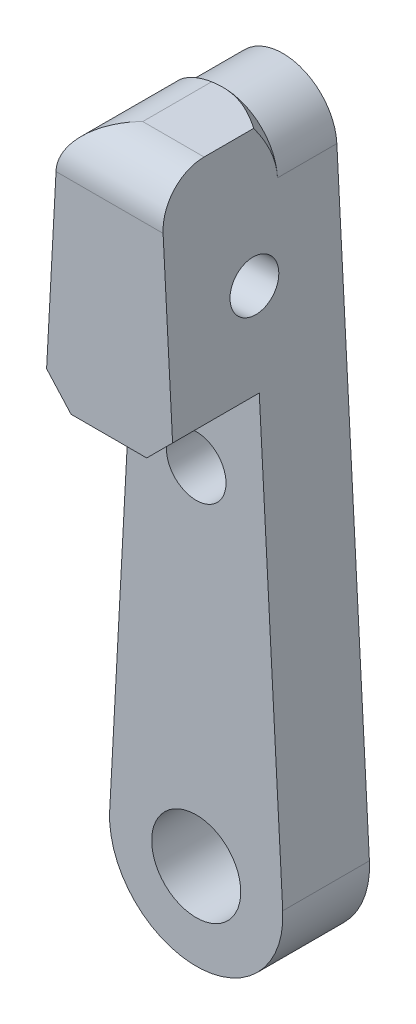
ISO-10303-21;
HEADER;
FILE_DESCRIPTION(('STEP AP214'),'2;1');
FILE_NAME('part.step','',(''),(''),'','','');
FILE_SCHEMA(('AUTOMOTIVE_DESIGN { 1 0 10303 214 1 1 1 1 }'));
ENDSEC;
DATA;
#1=APPLICATION_CONTEXT('core data for automotive mechanical design processes');
#2=APPLICATION_PROTOCOL_DEFINITION('international standard','automotive_design',2000,#1);
#3=PRODUCT_CONTEXT('',#1,'mechanical');
#4=PRODUCT('Part','Part','',(#3));
#5=PRODUCT_RELATED_PRODUCT_CATEGORY('part','',(#4));
#6=PRODUCT_DEFINITION_FORMATION('','',#4);
#7=PRODUCT_DEFINITION_CONTEXT('part definition',#1,'design');
#8=PRODUCT_DEFINITION('design','',#6,#7);
#9=PRODUCT_DEFINITION_SHAPE('','',#8);
#10=(LENGTH_UNIT() NAMED_UNIT(*) SI_UNIT(.MILLI.,.METRE.));
#11=(NAMED_UNIT(*) PLANE_ANGLE_UNIT() SI_UNIT($,.RADIAN.));
#12=(NAMED_UNIT(*) SI_UNIT($,.STERADIAN.) SOLID_ANGLE_UNIT());
#13=UNCERTAINTY_MEASURE_WITH_UNIT(LENGTH_MEASURE(1.E-05),#10,'distance_accuracy_value','');
#14=(GEOMETRIC_REPRESENTATION_CONTEXT(3) GLOBAL_UNCERTAINTY_ASSIGNED_CONTEXT((#13)) GLOBAL_UNIT_ASSIGNED_CONTEXT((#10,
#11,#12)) REPRESENTATION_CONTEXT('',''));
#15=CARTESIAN_POINT('',(0.,0.,0.));
#16=DIRECTION('',(0.,0.,1.));
#17=DIRECTION('',(1.,0.,0.));
#18=AXIS2_PLACEMENT_3D('',#15,#16,#17);
#19=CARTESIAN_POINT('',(-3.95667966414704,44.6628374857144,6.35));
#20=DIRECTION('',(0.998556345686213,-0.0537142857142856,0.));
#21=DIRECTION('',(0.0537142857142856,0.998556345686213,0.));
#22=AXIS2_PLACEMENT_3D('',#19,#20,#21);
#23=PLANE('',#22);
#24=CARTESIAN_POINT('',(-3.92252178054246,45.2978374857144,9.525));
#25=DIRECTION('',(0.998556345686213,-0.0537142857142856,0.));
#26=DIRECTION('',(-0.0537142857142856,-0.998556345686213,0.));
#27=AXIS2_PLACEMENT_3D('',#24,#25,#26);
#28=ELLIPSE('',#27,3.17959022915039,3.175);
#29=CARTESIAN_POINT('',(-3.92252178054246,45.2978374857144,12.7));
#30=VERTEX_POINT('',#29);
#31=CARTESIAN_POINT('',(-3.9133479489458,45.4683803428573,12.6954163975537));
#32=VERTEX_POINT('',#31);
#33=EDGE_CURVE('E390',#30,#32,#28,.F.);
#34=ORIENTED_EDGE('',*,*,#33,.T.);
#35=DIRECTION('',(0.,0.,-1.));
#36=VECTOR('',#35,1.);
#37=CARTESIAN_POINT('',(-3.9133479489458,45.4683803428573,6.35));
#38=LINE('',#37,#36);
#39=CARTESIAN_POINT('',(-3.91334794894579,45.4683803428574,4.43128528600289));
#40=VERTEX_POINT('',#39);
#41=EDGE_CURVE('E388',#32,#40,#38,.T.);
#42=ORIENTED_EDGE('',*,*,#41,.T.);
#43=CARTESIAN_POINT('',(-3.75173236251952,48.4728374857144,5.88839241168434));
#44=CARTESIAN_POINT('',(-3.75785567323401,48.3590042532838,5.80935084688004));
#45=CARTESIAN_POINT('',(-3.7640245767196,48.2443234446395,5.73150004897595));
#46=CARTESIAN_POINT('',(-3.7764732433354,48.0129009305126,5.57877744166713));
#47=CARTESIAN_POINT('',(-3.7827530737117,47.8961579749152,5.50390753553564));
#48=CARTESIAN_POINT('',(-3.79552221315823,47.6587778244817,5.35684776592851));
#49=CARTESIAN_POINT('',(-3.80201321180765,47.5381092201239,5.28470846839702));
#50=CARTESIAN_POINT('',(-3.81513878320356,47.2941029481636,5.14513527033369));
#51=CARTESIAN_POINT('',(-3.82177332842141,47.1707657923229,5.07770047789215));
#52=CARTESIAN_POINT('',(-3.83487793374441,46.9271492826926,4.95182834973537));
#53=CARTESIAN_POINT('',(-3.84134022881052,46.8070142821028,4.89311256937429));
#54=CARTESIAN_POINT('',(-3.854427686651,46.5637165466546,4.78221540453787));
#55=CARTESIAN_POINT('',(-3.8610528818643,46.4405532087515,4.73003533435954));
#56=CARTESIAN_POINT('',(-3.87443527855589,46.1917725173734,4.6339964827562));
#57=CARTESIAN_POINT('',(-3.88119156769469,46.0661721244216,4.59009404756772));
#58=CARTESIAN_POINT('',(-3.8948618550632,45.8120395036921,4.51197518938171));
#59=CARTESIAN_POINT('',(-3.90177573728429,45.6835094325317,4.47775187525206));
#60=CARTESIAN_POINT('',(-3.91266200301432,45.4811321770027,4.4332292663888));
#61=CARTESIAN_POINT('',(-3.91658899549159,45.4081288184829,4.41903125189004));
#62=CARTESIAN_POINT('',(-3.92447920516732,45.2614486786333,4.39443691015024));
#63=CARTESIAN_POINT('',(-3.92844243640039,45.1877716363981,4.38404212581209));
#64=CARTESIAN_POINT('',(-3.93644463133202,45.0390096744334,4.36717170249807));
#65=CARTESIAN_POINT('',(-3.94048391373614,44.9639188299212,4.36074814703654));
#66=CARTESIAN_POINT('',(-3.94857523962854,44.8134999104952,4.35215416375258));
#67=CARTESIAN_POINT('',(-3.95262728242178,44.7381718485025,4.34998350815793));
#68=CARTESIAN_POINT('',(-3.95667966414704,44.6628374857144,4.34999999999998));
#69=B_SPLINE_CURVE_WITH_KNOTS('',3,(#43,#44,#45,#46,#47,#48,#49,#50,#51,#52,#53,#54,#55,#56,#57,
#58,#59,#60,#61,#62,#63,#64,#65,#66,#67,#68),.UNSPECIFIED.,.F.,.F.,(4,2,2,2,2,2,2,2,2,2,2,2,4),
(0.,0.416178927517582,0.83261945418778,1.25474733928982,1.67679497601198,2.07825355600473,
2.47979273803573,2.87915116412819,3.27822454372349,3.50156316257956,3.72499228574556,
3.95129279783771,4.17758118964001),.UNSPECIFIED.);
#70=CARTESIAN_POINT('',(-3.95667966414704,44.6628374857144,4.34999999999999));
#71=VERTEX_POINT('',#70);
#72=EDGE_CURVE('E266',#40,#71,#69,.T.);
#73=ORIENTED_EDGE('',*,*,#72,.T.);
#74=DIRECTION('',(0.,0.,-1.));
#75=VECTOR('',#74,1.);
#76=CARTESIAN_POINT('',(-3.95667966414704,44.6628374857144,6.35));
#77=LINE('',#76,#75);
#78=CARTESIAN_POINT('',(-3.95667966414704,44.6628374857144,0.));
#79=VERTEX_POINT('',#78);
#80=EDGE_CURVE('E209',#71,#79,#77,.T.);
#81=ORIENTED_EDGE('',*,*,#80,.T.);
#82=DIRECTION('',(-0.0537142857142856,-0.998556345686213,0.));
#83=VECTOR('',#82,1.);
#84=CARTESIAN_POINT('',(-3.95667966414704,44.6628374857144,0.));
#85=LINE('',#84,#83);
#86=CARTESIAN_POINT('',(-6.34083279510745,0.34108571428571,0.));
#87=VERTEX_POINT('',#86);
#88=EDGE_CURVE('E236',#79,#87,#85,.T.);
#89=ORIENTED_EDGE('',*,*,#88,.T.);
#90=DIRECTION('',(0.,0.,-1.));
#91=VECTOR('',#90,1.);
#92=CARTESIAN_POINT('',(-6.34083279510745,0.34108571428571,6.35));
#93=LINE('',#92,#91);
#94=CARTESIAN_POINT('',(-6.34083279510745,0.34108571428571,6.35));
#95=VERTEX_POINT('',#94);
#96=EDGE_CURVE('E212',#95,#87,#93,.T.);
#97=ORIENTED_EDGE('',*,*,#96,.F.);
#98=DIRECTION('',(-0.0537142857142856,-0.998556345686213,0.));
#99=VECTOR('',#98,1.);
#100=CARTESIAN_POINT('',(-3.95667966414704,44.6628374857144,6.35));
#101=LINE('',#100,#99);
#102=CARTESIAN_POINT('',(-4.61408291891322,32.4416158313241,6.35));
#103=VERTEX_POINT('',#102);
#104=EDGE_CURVE('E216',#103,#95,#101,.T.);
#105=ORIENTED_EDGE('',*,*,#104,.F.);
#106=DIRECTION('',(0.,0.,1.));
#107=VECTOR('',#106,1.);
#108=CARTESIAN_POINT('',(-4.61408291891322,32.4416158313241,6.35));
#109=LINE('',#108,#107);
#110=CARTESIAN_POINT('',(-4.61408291891322,32.4416158313241,12.7));
#111=VERTEX_POINT('',#110);
#112=EDGE_CURVE('E208',#103,#111,#109,.T.);
#113=ORIENTED_EDGE('',*,*,#112,.T.);
#114=DIRECTION('',(-0.0537142857142856,-0.998556345686213,0.));
#115=VECTOR('',#114,1.);
#116=CARTESIAN_POINT('',(-4.72151149034179,30.4445031399517,12.7));
#117=LINE('',#116,#115);
#118=EDGE_CURVE('E185',#30,#111,#117,.T.);
#119=ORIENTED_EDGE('',*,*,#118,.F.);
#120=EDGE_LOOP('',(#34,#42,#73,#81,#89,#97,#105,#113,#119));
#121=FACE_BOUND('',#120,.T.);
#122=DIRECTION('',(-0.0537142857142856,-0.998556345686213,0.));
#123=VECTOR('',#122,1.);
#124=CARTESIAN_POINT('',(-3.95667966414704,44.6628374857144,3.002));
#125=LINE('',#124,#123);
#126=CARTESIAN_POINT('',(-4.10722604370954,41.8641585005402,3.002));
#127=VERTEX_POINT('',#126);
#128=CARTESIAN_POINT('',(-4.46898440904249,35.139018130439,3.002));
#129=VERTEX_POINT('',#128);
#130=EDGE_CURVE('E402',#127,#129,#125,.T.);
#131=ORIENTED_EDGE('',*,*,#130,.F.);
#132=DIRECTION('',(0.,0.,-1.));
#133=VECTOR('',#132,1.);
#134=CARTESIAN_POINT('',(-4.10722604370954,41.8641585005402,6.35));
#135=LINE('',#134,#133);
#136=CARTESIAN_POINT('',(-4.10722604370954,41.8641585005402,9.698));
#137=VERTEX_POINT('',#136);
#138=EDGE_CURVE('E171',#137,#127,#135,.T.);
#139=ORIENTED_EDGE('',*,*,#138,.F.);
#140=DIRECTION('',(0.0537142857142856,0.998556345686213,0.));
#141=VECTOR('',#140,1.);
#142=CARTESIAN_POINT('',(-3.95667966414704,44.6628374857144,9.698));
#143=LINE('',#142,#141);
#144=CARTESIAN_POINT('',(-4.46898440904249,35.139018130439,9.698));
#145=VERTEX_POINT('',#144);
#146=EDGE_CURVE('E406',#145,#137,#143,.T.);
#147=ORIENTED_EDGE('',*,*,#146,.F.);
#148=DIRECTION('',(0.,0.,1.));
#149=VECTOR('',#148,1.);
#150=CARTESIAN_POINT('',(-4.46898440904249,35.139018130439,6.35));
#151=LINE('',#150,#149);
#152=EDGE_CURVE('E295',#129,#145,#151,.T.);
#153=ORIENTED_EDGE('',*,*,#152,.F.);
#154=EDGE_LOOP('',(#131,#139,#147,#153));
#155=FACE_BOUND('',#154,.T.);
#156=ADVANCED_FACE('F33',(#121,#155),#23,.F.);
#157=CARTESIAN_POINT('',(4.26336093394811,38.9615882930533,6.35));
#158=DIRECTION('',(0.998556345686213,0.0537142857142853,0.));
#159=DIRECTION('',(-0.0537142857142853,0.998556345686213,0.));
#160=AXIS2_PLACEMENT_3D('',#157,#158,#159);
#161=CYLINDRICAL_SURFACE('',#160,1.78600099999999);
#162=CARTESIAN_POINT('',(4.26336093394811,38.9615882930533,6.35));
#163=DIRECTION('',(0.998556345686213,0.0537142857142853,0.));
#164=DIRECTION('',(-0.0537142857142853,0.998556345686213,0.));
#165=AXIS2_PLACEMENT_3D('',#162,#163,#164);
#166=CIRCLE('',#165,1.78600099999999);
#167=CARTESIAN_POINT('',(4.16742716594811,40.7450109250052,6.35));
#168=VERTEX_POINT('',#167);
#169=EDGE_CURVE('E176',#168,#168,#166,.T.);
#170=ORIENTED_EDGE('',*,*,#169,.T.);
#171=EDGE_LOOP('',(#170));
#172=FACE_BOUND('',#171,.T.);
#173=CARTESIAN_POINT('',(-1.95028805188646,38.6273440429463,6.35));
#174=DIRECTION('',(-0.998556345686213,-0.0537142857142853,0.));
#175=DIRECTION('',(0.0537142857142853,-0.998556345686213,0.));
#176=AXIS2_PLACEMENT_3D('',#173,#174,#175);
#177=CIRCLE('',#176,1.78600099999999);
#178=CARTESIAN_POINT('',(-1.85435428388646,36.8439214109944,6.35));
#179=VERTEX_POINT('',#178);
#180=EDGE_CURVE('E172',#179,#179,#177,.F.);
#181=ORIENTED_EDGE('',*,*,#180,.F.);
#182=EDGE_LOOP('',(#181));
#183=FACE_BOUND('',#182,.T.);
#184=ADVANCED_FACE('F306',(#172,#183),#161,.F.);
#185=CARTESIAN_POINT('',(0.,0.,6.35));
#186=DIRECTION('',(0.,0.,-1.));
#187=DIRECTION('',(-1.,0.,0.));
#188=AXIS2_PLACEMENT_3D('',#185,#186,#187);
#189=CYLINDRICAL_SURFACE('',#188,6.35);
#190=CARTESIAN_POINT('',(0.,0.,0.));
#191=DIRECTION('',(0.,0.,1.));
#192=DIRECTION('',(1.,0.,0.));
#193=AXIS2_PLACEMENT_3D('',#190,#191,#192);
#194=CIRCLE('',#193,6.35);
#195=CARTESIAN_POINT('',(6.34083279510745,0.341085714285708,0.));
#196=VERTEX_POINT('',#195);
#197=EDGE_CURVE('E226',#87,#196,#194,.T.);
#198=ORIENTED_EDGE('',*,*,#197,.T.);
#199=DIRECTION('',(0.,0.,-1.));
#200=VECTOR('',#199,1.);
#201=CARTESIAN_POINT('',(6.34083279510745,0.341085714285708,6.35));
#202=LINE('',#201,#200);
#203=CARTESIAN_POINT('',(6.34083279510745,0.341085714285708,6.35));
#204=VERTEX_POINT('',#203);
#205=EDGE_CURVE('E205',#204,#196,#202,.T.);
#206=ORIENTED_EDGE('',*,*,#205,.F.);
#207=CARTESIAN_POINT('',(0.,0.,6.35));
#208=DIRECTION('',(0.,0.,1.));
#209=DIRECTION('',(1.,0.,0.));
#210=AXIS2_PLACEMENT_3D('',#207,#208,#209);
#211=CIRCLE('',#210,6.35);
#212=EDGE_CURVE('E238',#95,#204,#211,.T.);
#213=ORIENTED_EDGE('',*,*,#212,.F.);
#214=ORIENTED_EDGE('',*,*,#96,.T.);
#215=EDGE_LOOP('',(#198,#206,#213,#214));
#216=FACE_BOUND('',#215,.T.);
#217=ADVANCED_FACE('F303',(#216),#189,.T.);
#218=CARTESIAN_POINT('',(3.95667966414706,44.6628374857144,6.35));
#219=DIRECTION('',(-0.998556345686213,-0.0537142857142853,0.));
#220=DIRECTION('',(0.0537142857142853,-0.998556345686213,0.));
#221=AXIS2_PLACEMENT_3D('',#218,#219,#220);
#222=PLANE('',#221);
#223=ORIENTED_EDGE('',*,*,#169,.F.);
#224=EDGE_LOOP('',(#223));
#225=FACE_BOUND('',#224,.T.);
#226=DIRECTION('',(0.,0.,-1.));
#227=VECTOR('',#226,1.);
#228=CARTESIAN_POINT('',(3.75173236251952,48.4728374857144,12.7));
#229=LINE('',#228,#227);
#230=CARTESIAN_POINT('',(3.75173236251952,48.4728374857144,9.525));
#231=VERTEX_POINT('',#230);
#232=CARTESIAN_POINT('',(3.75173236251954,48.4728374857144,5.88839241168434));
#233=VERTEX_POINT('',#232);
#234=EDGE_CURVE('E192',#231,#233,#229,.T.);
#235=ORIENTED_EDGE('',*,*,#234,.F.);
#236=CARTESIAN_POINT('',(3.92252178054247,45.2978374857144,9.525));
#237=DIRECTION('',(-0.998556345686213,-0.0537142857142853,0.));
#238=DIRECTION('',(-0.0537142857142853,0.998556345686213,0.));
#239=AXIS2_PLACEMENT_3D('',#236,#237,#238);
#240=ELLIPSE('',#239,3.17959022915039,3.175);
#241=CARTESIAN_POINT('',(3.92252178054247,45.2978374857144,12.7));
#242=VERTEX_POINT('',#241);
#243=EDGE_CURVE('E11',#231,#242,#240,.F.);
#244=ORIENTED_EDGE('',*,*,#243,.T.);
#245=DIRECTION('',(-0.0537142857142858,0.998556345686213,0.));
#246=VECTOR('',#245,1.);
#247=CARTESIAN_POINT('',(4.7215114903418,30.4445031399517,12.7));
#248=LINE('',#247,#246);
#249=CARTESIAN_POINT('',(4.61941934006903,32.3424109896789,12.7));
#250=VERTEX_POINT('',#249);
#251=EDGE_CURVE('E190',#250,#242,#248,.T.);
#252=ORIENTED_EDGE('',*,*,#251,.F.);
#253=DIRECTION('',(0.,0.,-1.));
#254=VECTOR('',#253,1.);
#255=CARTESIAN_POINT('',(4.61941934006903,32.3424109896789,6.35));
#256=LINE('',#255,#254);
#257=CARTESIAN_POINT('',(4.61941934006903,32.3424109896789,6.35));
#258=VERTEX_POINT('',#257);
#259=EDGE_CURVE('E249',#250,#258,#256,.T.);
#260=ORIENTED_EDGE('',*,*,#259,.T.);
#261=DIRECTION('',(-0.0537142857142853,0.998556345686213,0.));
#262=VECTOR('',#261,1.);
#263=CARTESIAN_POINT('',(3.95667966414706,44.6628374857144,6.35));
#264=LINE('',#263,#262);
#265=EDGE_CURVE('E219',#204,#258,#264,.T.);
#266=ORIENTED_EDGE('',*,*,#265,.F.);
#267=ORIENTED_EDGE('',*,*,#205,.T.);
#268=DIRECTION('',(-0.0537142857142853,0.998556345686213,0.));
#269=VECTOR('',#268,1.);
#270=CARTESIAN_POINT('',(3.95667966414706,44.6628374857144,0.));
#271=LINE('',#270,#269);
#272=CARTESIAN_POINT('',(3.95667966414706,44.6628374857144,0.));
#273=VERTEX_POINT('',#272);
#274=EDGE_CURVE('E229',#196,#273,#271,.T.);
#275=ORIENTED_EDGE('',*,*,#274,.T.);
#276=DIRECTION('',(0.,0.,-1.));
#277=VECTOR('',#276,1.);
#278=CARTESIAN_POINT('',(3.95667966414706,44.6628374857144,6.35));
#279=LINE('',#278,#277);
#280=CARTESIAN_POINT('',(3.95667966414706,44.6628374857144,4.34999999999999));
#281=VERTEX_POINT('',#280);
#282=EDGE_CURVE('E211',#281,#273,#279,.T.);
#283=ORIENTED_EDGE('',*,*,#282,.F.);
#284=CARTESIAN_POINT('',(3.95667966414706,44.6628374857144,4.34999999999999));
#285=CARTESIAN_POINT('',(3.95340653700155,44.7236853930806,4.34999508720953));
#286=CARTESIAN_POINT('',(3.95013389337306,44.7845243117956,4.35140635997852));
#287=CARTESIAN_POINT('',(3.94359602361617,44.906064256825,4.3570150717467));
#288=CARTESIAN_POINT('',(3.94033079635821,44.9667653041382,4.36121205328373));
#289=CARTESIAN_POINT('',(3.93056814816547,45.1482543470238,4.37788932380299));
#290=CARTESIAN_POINT('',(3.92408980264984,45.268687727793,4.3944563331611));
#291=CARTESIAN_POINT('',(3.91134439083975,45.505626778031,4.43723673501114));
#292=CARTESIAN_POINT('',(3.90507560944444,45.6221643314725,4.46327742909877));
#293=CARTESIAN_POINT('',(3.892657472358,45.8530192972302,4.52387799658952));
#294=CARTESIAN_POINT('',(3.8865081552599,45.9673359920962,4.5584405752002));
#295=CARTESIAN_POINT('',(3.86905166723329,46.2918546310498,4.66804524612588));
#296=CARTESIAN_POINT('',(3.85790883228433,46.4990015454927,4.75215384925392));
#297=CARTESIAN_POINT('',(3.83605421056,46.9052821264443,4.93851799004276));
#298=CARTESIAN_POINT('',(3.82534347121598,47.1043963210526,5.04081471299057));
#299=CARTESIAN_POINT('',(3.80937429638504,47.4012655924347,5.20571497855704));
#300=CARTESIAN_POINT('',(3.80397541186756,47.5016316370142,5.26369432887994));
#301=CARTESIAN_POINT('',(3.7932689417071,47.7006664668823,5.38252806775253));
#302=CARTESIAN_POINT('',(3.787961364285,47.7993350993435,5.44338271335202));
#303=CARTESIAN_POINT('',(3.77745849057565,47.9945850417182,5.5671342018412));
#304=CARTESIAN_POINT('',(3.77226272389151,48.091175096378,5.63001727605397));
#305=CARTESIAN_POINT('',(3.76194489871444,48.2829849597548,5.75778622237895));
#306=CARTESIAN_POINT('',(3.75682281853307,48.3782051716632,5.82267148673188));
#307=CARTESIAN_POINT('',(3.75173236251954,48.4728374857144,5.88839241168435));
#308=B_SPLINE_CURVE_WITH_KNOTS('',3,(#284,#285,#286,#287,#288,#289,#290,#291,#292,#293,#294,
#295,#296,#297,#298,#299,#300,#301,#302,#303,#304,#305,#306,#307),.UNSPECIFIED.,.F.,.F.,(4,2,2,
2,2,2,2,2,2,2,2,4),(0.,0.182774094680135,0.365518182077416,0.730229720674583,1.08860114697889,
1.44708648236932,2.11727612122815,2.78900313117127,3.13706809518872,3.48516423511634,
3.83125704062186,4.17724580451023),.UNSPECIFIED.);
#309=EDGE_CURVE('E289',#281,#233,#308,.T.);
#310=ORIENTED_EDGE('',*,*,#309,.T.);
#311=EDGE_LOOP('',(#235,#244,#252,#260,#266,#267,#275,#283,#310));
#312=FACE_BOUND('',#311,.T.);
#313=ADVANCED_FACE('F297',(#225,#312),#222,.F.);
#314=CARTESIAN_POINT('',(0.,44.4500000000002,6.35));
#315=DIRECTION('',(0.,0.,-1.));
#316=DIRECTION('',(-1.,0.,0.));
#317=AXIS2_PLACEMENT_3D('',#314,#315,#316);
#318=CYLINDRICAL_SURFACE('',#317,3.9624);
#319=ORIENTED_EDGE('',*,*,#80,.F.);
#320=CARTESIAN_POINT('',(0.,44.4500000000002,4.34999999999999));
#321=DIRECTION('',(0.,0.,-1.));
#322=DIRECTION('',(-1.,0.,0.));
#323=AXIS2_PLACEMENT_3D('',#320,#321,#322);
#324=CIRCLE('',#323,3.9624);
#325=EDGE_CURVE('E252',#71,#281,#324,.T.);
#326=ORIENTED_EDGE('',*,*,#325,.T.);
#327=ORIENTED_EDGE('',*,*,#282,.T.);
#328=CARTESIAN_POINT('',(0.,44.4500000000002,0.));
#329=DIRECTION('',(0.,0.,1.));
#330=DIRECTION('',(1.,0.,0.));
#331=AXIS2_PLACEMENT_3D('',#328,#329,#330);
#332=CIRCLE('',#331,3.9624);
#333=EDGE_CURVE('E233',#273,#79,#332,.T.);
#334=ORIENTED_EDGE('',*,*,#333,.T.);
#335=EDGE_LOOP('',(#319,#326,#327,#334));
#336=FACE_BOUND('',#335,.T.);
#337=ADVANCED_FACE('F302',(#336),#318,.T.);
#338=CARTESIAN_POINT('',(0.,0.,6.35));
#339=DIRECTION('',(0.,0.,1.));
#340=DIRECTION('',(1.,0.,0.));
#341=AXIS2_PLACEMENT_3D('',#338,#339,#340);
#342=PLANE('',#341);
#343=DIRECTION('',(1.,0.,0.));
#344=VECTOR('',#343,1.);
#345=CARTESIAN_POINT('',(0.,30.4445031399517,6.35));
#346=LINE('',#345,#344);
#347=CARTESIAN_POINT('',(-2.82085975654007,30.4445031399517,6.35));
#348=VERTEX_POINT('',#347);
#349=CARTESIAN_POINT('',(2.7215114903418,30.4445031399517,6.35));
#350=VERTEX_POINT('',#349);
#351=EDGE_CURVE('E184',#348,#350,#346,.T.);
#352=ORIENTED_EDGE('',*,*,#351,.F.);
#353=DIRECTION('',(0.668104227756414,-0.744067699106745,0.));
#354=VECTOR('',#353,1.);
#355=CARTESIAN_POINT('',(-2.82085975654007,30.4445031399517,6.35));
#356=LINE('',#355,#354);
#357=EDGE_CURVE('E254',#348,#103,#356,.F.);
#358=ORIENTED_EDGE('',*,*,#357,.T.);
#359=ORIENTED_EDGE('',*,*,#104,.T.);
#360=ORIENTED_EDGE('',*,*,#212,.T.);
#361=ORIENTED_EDGE('',*,*,#265,.T.);
#362=DIRECTION('',(0.70710678118655,0.707106781186545,0.));
#363=VECTOR('',#362,1.);
#364=CARTESIAN_POINT('',(4.61941934006903,32.3424109896789,6.35));
#365=LINE('',#364,#363);
#366=EDGE_CURVE('E257',#258,#350,#365,.F.);
#367=ORIENTED_EDGE('',*,*,#366,.T.);
#368=EDGE_LOOP('',(#352,#358,#359,#360,#361,#367));
#369=FACE_BOUND('',#368,.T.);
#370=CARTESIAN_POINT('',(0.,25.4,6.35));
#371=DIRECTION('',(0.,0.,1.));
#372=DIRECTION('',(1.,0.,0.));
#373=AXIS2_PLACEMENT_3D('',#370,#371,#372);
#374=CIRCLE('',#373,2.18287599999999);
#375=CARTESIAN_POINT('',(2.18287599999999,25.4,6.35));
#376=VERTEX_POINT('',#375);
#377=EDGE_CURVE('E376',#376,#376,#374,.T.);
#378=ORIENTED_EDGE('',*,*,#377,.F.);
#379=EDGE_LOOP('',(#378));
#380=FACE_BOUND('',#379,.T.);
#381=CARTESIAN_POINT('',(0.,0.,6.35));
#382=DIRECTION('',(0.,0.,1.));
#383=DIRECTION('',(1.,0.,0.));
#384=AXIS2_PLACEMENT_3D('',#381,#382,#383);
#385=CIRCLE('',#384,3.2639);
#386=CARTESIAN_POINT('',(3.2639,0.,6.35));
#387=VERTEX_POINT('',#386);
#388=EDGE_CURVE('E371',#387,#387,#385,.T.);
#389=ORIENTED_EDGE('',*,*,#388,.F.);
#390=EDGE_LOOP('',(#389));
#391=FACE_BOUND('',#390,.T.);
#392=ADVANCED_FACE('F333',(#369,#380,#391),#342,.T.);
#393=CARTESIAN_POINT('',(0.,0.,0.));
#394=DIRECTION('',(0.,0.,1.));
#395=DIRECTION('',(1.,0.,0.));
#396=AXIS2_PLACEMENT_3D('',#393,#394,#395);
#397=PLANE('',#396);
#398=CARTESIAN_POINT('',(0.,25.4,0.));
#399=DIRECTION('',(0.,0.,1.));
#400=DIRECTION('',(1.,0.,0.));
#401=AXIS2_PLACEMENT_3D('',#398,#399,#400);
#402=CIRCLE('',#401,2.18287599999999);
#403=CARTESIAN_POINT('',(2.18287599999999,25.4,0.));
#404=VERTEX_POINT('',#403);
#405=EDGE_CURVE('E374',#404,#404,#402,.T.);
#406=ORIENTED_EDGE('',*,*,#405,.T.);
#407=EDGE_LOOP('',(#406));
#408=FACE_BOUND('',#407,.T.);
#409=CARTESIAN_POINT('',(0.,0.,0.));
#410=DIRECTION('',(0.,0.,1.));
#411=DIRECTION('',(1.,0.,0.));
#412=AXIS2_PLACEMENT_3D('',#409,#410,#411);
#413=CIRCLE('',#412,3.2639);
#414=CARTESIAN_POINT('',(3.2639,0.,0.));
#415=VERTEX_POINT('',#414);
#416=EDGE_CURVE('E230',#415,#415,#413,.T.);
#417=ORIENTED_EDGE('',*,*,#416,.T.);
#418=EDGE_LOOP('',(#417));
#419=FACE_BOUND('',#418,.T.);
#420=ORIENTED_EDGE('',*,*,#197,.F.);
#421=ORIENTED_EDGE('',*,*,#88,.F.);
#422=ORIENTED_EDGE('',*,*,#333,.F.);
#423=ORIENTED_EDGE('',*,*,#274,.F.);
#424=EDGE_LOOP('',(#420,#421,#422,#423));
#425=FACE_BOUND('',#424,.T.);
#426=ADVANCED_FACE('F329',(#408,#419,#425),#397,.F.);
#427=CARTESIAN_POINT('',(0.,0.,6.35));
#428=DIRECTION('',(0.,0.,1.));
#429=DIRECTION('',(1.,0.,0.));
#430=AXIS2_PLACEMENT_3D('',#427,#428,#429);
#431=CYLINDRICAL_SURFACE('',#430,3.2639);
#432=ORIENTED_EDGE('',*,*,#416,.F.);
#433=EDGE_LOOP('',(#432));
#434=FACE_BOUND('',#433,.T.);
#435=ORIENTED_EDGE('',*,*,#388,.T.);
#436=EDGE_LOOP('',(#435));
#437=FACE_BOUND('',#436,.T.);
#438=ADVANCED_FACE('F332',(#434,#437),#431,.F.);
#439=CARTESIAN_POINT('',(0.,25.4,6.35));
#440=DIRECTION('',(0.,0.,1.));
#441=DIRECTION('',(1.,0.,0.));
#442=AXIS2_PLACEMENT_3D('',#439,#440,#441);
#443=CYLINDRICAL_SURFACE('',#442,2.18287599999999);
#444=ORIENTED_EDGE('',*,*,#405,.F.);
#445=EDGE_LOOP('',(#444));
#446=FACE_BOUND('',#445,.T.);
#447=ORIENTED_EDGE('',*,*,#377,.T.);
#448=EDGE_LOOP('',(#447));
#449=FACE_BOUND('',#448,.T.);
#450=ADVANCED_FACE('F340',(#446,#449),#443,.F.);
#451=CARTESIAN_POINT('',(0.,30.4445031399517,12.7));
#452=DIRECTION('',(0.,1.,0.));
#453=DIRECTION('',(-1.,0.,0.));
#454=AXIS2_PLACEMENT_3D('',#451,#452,#453);
#455=PLANE('',#454);
#456=DIRECTION('',(1.,0.,0.));
#457=VECTOR('',#456,1.);
#458=CARTESIAN_POINT('',(-4.72151149034179,30.4445031399517,12.7));
#459=LINE('',#458,#457);
#460=CARTESIAN_POINT('',(-2.82085975654007,30.4445031399517,12.7));
#461=VERTEX_POINT('',#460);
#462=CARTESIAN_POINT('',(2.7215114903418,30.4445031399517,12.7));
#463=VERTEX_POINT('',#462);
#464=EDGE_CURVE('E187',#461,#463,#459,.T.);
#465=ORIENTED_EDGE('',*,*,#464,.F.);
#466=DIRECTION('',(0.,0.,-1.));
#467=VECTOR('',#466,1.);
#468=CARTESIAN_POINT('',(-2.82085975654007,30.4445031399517,12.7));
#469=LINE('',#468,#467);
#470=EDGE_CURVE('E204',#461,#348,#469,.T.);
#471=ORIENTED_EDGE('',*,*,#470,.T.);
#472=ORIENTED_EDGE('',*,*,#351,.T.);
#473=DIRECTION('',(0.,0.,1.));
#474=VECTOR('',#473,1.);
#475=CARTESIAN_POINT('',(2.7215114903418,30.4445031399517,12.7));
#476=LINE('',#475,#474);
#477=EDGE_CURVE('E202',#350,#463,#476,.T.);
#478=ORIENTED_EDGE('',*,*,#477,.T.);
#479=EDGE_LOOP('',(#465,#471,#472,#478));
#480=FACE_BOUND('',#479,.T.);
#481=ADVANCED_FACE('F343',(#480),#455,.F.);
#482=CARTESIAN_POINT('',(-3.75173236251952,48.4728374857144,12.7));
#483=DIRECTION('',(0.,-1.,0.));
#484=DIRECTION('',(0.,0.,-1.));
#485=AXIS2_PLACEMENT_3D('',#482,#483,#484);
#486=PLANE('',#485);
#487=CARTESIAN_POINT('',(3.75173236251954,48.4728374857144,5.88839241168434));
#488=CARTESIAN_POINT('',(3.65921549744006,48.4728374857144,5.82530500535887));
#489=CARTESIAN_POINT('',(3.56612294167084,48.4728374857144,5.76304912457944));
#490=CARTESIAN_POINT('',(3.37860817201253,48.4728374857144,5.64051744617827));
#491=CARTESIAN_POINT('',(3.28418559452919,48.4728374857144,5.58024220563455));
#492=CARTESIAN_POINT('',(3.09329112140356,48.4728374857144,5.46165613593129));
#493=CARTESIAN_POINT('',(2.99681012305899,48.4728374857144,5.40335988533356));
#494=CARTESIAN_POINT('',(2.80221597977702,48.4728374857144,5.2895812629456));
#495=CARTESIAN_POINT('',(2.7041029554373,48.4728374857144,5.23409868445649));
#496=CARTESIAN_POINT('',(2.40159121731081,48.4728374857144,5.06964673124088));
#497=CARTESIAN_POINT('',(2.1942419539055,48.4728374857144,4.96598877808725));
#498=CARTESIAN_POINT('',(1.77094750476866,48.4728374857144,4.77891646888919));
#499=CARTESIAN_POINT('',(1.55502679653574,48.4728374857144,4.69544870358311));
#500=CARTESIAN_POINT('',(1.21784471734664,48.4728374857144,4.58927661484219));
#501=CARTESIAN_POINT('',(1.09976982240277,48.4728374857144,4.55644815204336));
#502=CARTESIAN_POINT('',(0.86137915863495,48.4728374857144,4.49999517690996));
#503=CARTESIAN_POINT('',(0.741062980922717,48.4728374857144,4.47637236158352));
#504=CARTESIAN_POINT('',(0.499876102224488,48.4728374857144,4.43963929067267));
#505=CARTESIAN_POINT('',(0.379019076036018,48.4728374857144,4.426440346056));
#506=CARTESIAN_POINT('',(0.136648045510812,48.4728374857144,4.41094287627052));
#507=CARTESIAN_POINT('',(0.0151343859718046,48.4728374857144,4.40863909937384));
#508=CARTESIAN_POINT('',(-0.203139554790107,48.4728374857144,4.41439562433596));
#509=CARTESIAN_POINT('',(-0.299957802608411,48.4728374857144,4.42046261936648));
#510=CARTESIAN_POINT('',(-0.492972338254964,48.4728374857144,4.43939098772064));
#511=CARTESIAN_POINT('',(-0.589168262756789,48.4728374857144,4.45225602109884));
#512=CARTESIAN_POINT('',(-0.830900518134331,48.4728374857144,4.49282961962917));
#513=CARTESIAN_POINT('',(-0.975732102041202,48.4728374857144,4.5247875043753));
#514=CARTESIAN_POINT('',(-1.26202378252741,48.4728374857144,4.60148650065332));
#515=CARTESIAN_POINT('',(-1.40348068280169,48.4728374857144,4.64623924756757));
#516=CARTESIAN_POINT('',(-1.68349578373218,48.4728374857144,4.74651891308399));
#517=CARTESIAN_POINT('',(-1.82202960541024,48.4728374857144,4.80211302526866));
#518=CARTESIAN_POINT('',(-2.09531892775469,48.4728374857144,4.92174638699604));
#519=CARTESIAN_POINT('',(-2.23007530412771,48.4728374857144,4.98578365923709));
#520=CARTESIAN_POINT('',(-2.48460589257346,48.4728374857144,5.11470477648679));
#521=CARTESIAN_POINT('',(-2.60466475533978,48.4728374857144,5.17903193582557));
#522=CARTESIAN_POINT('',(-2.84224379204931,48.4728374857144,5.31222171096162));
#523=CARTESIAN_POINT('',(-2.95976370894145,48.4728374857144,5.38108478315814));
#524=CARTESIAN_POINT('',(-3.19078550316259,48.4728374857144,5.52141198825534));
#525=CARTESIAN_POINT('',(-3.30432131194068,48.4728374857144,5.59282057899142));
#526=CARTESIAN_POINT('',(-3.52942237899723,48.4728374857144,5.73855952909991));
#527=CARTESIAN_POINT('',(-3.64098862208436,48.4728374857144,5.81288836468043));
#528=CARTESIAN_POINT('',(-3.75173236251952,48.4728374857144,5.88839241168434));
#529=B_SPLINE_CURVE_WITH_KNOTS('',3,(#487,#488,#489,#490,#491,#492,#493,#494,#495,#496,#497,
#498,#499,#500,#501,#502,#503,#504,#505,#506,#507,#508,#509,#510,#511,#512,#513,#514,#515,#516,
#517,#518,#519,#520,#521,#522,#523,#524,#525,#526,#527,#528),.UNSPECIFIED.,.F.,.F.,(4,2,2,2,2,2,
2,2,2,2,2,2,2,2,2,2,2,2,2,2,4),(0.,0.335943873707882,0.671981440535551,1.01011262312788,
1.34821892972833,2.04295555939505,2.73583379056648,3.10319057693602,3.47061505141539,
3.83487865154858,4.19896665012478,4.48974943155941,4.78068892980219,5.2249017848105,
5.66951988972005,6.11698668675955,6.56434887717425,6.97285270421916,7.38139769750653,
7.7837244620297,8.18584400923582),.UNSPECIFIED.);
#530=CARTESIAN_POINT('',(-0.742931551394212,48.4728374857144,4.47846405622636));
#531=VERTEX_POINT('',#530);
#532=EDGE_CURVE('E259',#233,#531,#529,.T.);
#533=ORIENTED_EDGE('',*,*,#532,.T.);
#534=DIRECTION('',(0.,0.,-1.));
#535=VECTOR('',#534,1.);
#536=CARTESIAN_POINT('',(-0.742931551392071,48.4728374857144,12.7));
#537=LINE('',#536,#535);
#538=CARTESIAN_POINT('',(-0.742931551392071,48.4728374857144,9.525));
#539=VERTEX_POINT('',#538);
#540=EDGE_CURVE('E55',#531,#539,#537,.F.);
#541=ORIENTED_EDGE('',*,*,#540,.T.);
#542=DIRECTION('',(-1.,0.,0.));
#543=VECTOR('',#542,1.);
#544=CARTESIAN_POINT('',(-3.75173236251952,48.4728374857144,9.525));
#545=LINE('',#544,#543);
#546=EDGE_CURVE('E381',#539,#231,#545,.F.);
#547=ORIENTED_EDGE('',*,*,#546,.T.);
#548=ORIENTED_EDGE('',*,*,#234,.T.);
#549=EDGE_LOOP('',(#533,#541,#547,#548));
#550=FACE_BOUND('',#549,.T.);
#551=ADVANCED_FACE('F272',(#550),#486,.F.);
#552=CARTESIAN_POINT('',(0.,0.,12.7));
#553=DIRECTION('',(0.,0.,-1.));
#554=DIRECTION('',(-1.,0.,0.));
#555=AXIS2_PLACEMENT_3D('',#552,#553,#554);
#556=PLANE('',#555);
#557=ORIENTED_EDGE('',*,*,#251,.T.);
#558=DIRECTION('',(-1.,0.,0.));
#559=VECTOR('',#558,1.);
#560=CARTESIAN_POINT('',(0.,45.2978374857144,12.7));
#561=LINE('',#560,#559);
#562=EDGE_CURVE('E42',#242,#30,#561,.T.);
#563=ORIENTED_EDGE('',*,*,#562,.T.);
#564=ORIENTED_EDGE('',*,*,#118,.T.);
#565=DIRECTION('',(-0.668104227756414,0.744067699106745,0.));
#566=VECTOR('',#565,1.);
#567=CARTESIAN_POINT('',(-2.82085975654007,30.4445031399517,12.7));
#568=LINE('',#567,#566);
#569=EDGE_CURVE('E248',#111,#461,#568,.F.);
#570=ORIENTED_EDGE('',*,*,#569,.T.);
#571=ORIENTED_EDGE('',*,*,#464,.T.);
#572=DIRECTION('',(-0.70710678118655,-0.707106781186545,0.));
#573=VECTOR('',#572,1.);
#574=CARTESIAN_POINT('',(4.61941934006903,32.3424109896789,12.7));
#575=LINE('',#574,#573);
#576=EDGE_CURVE('E362',#463,#250,#575,.F.);
#577=ORIENTED_EDGE('',*,*,#576,.T.);
#578=EDGE_LOOP('',(#557,#563,#564,#570,#571,#577));
#579=FACE_BOUND('',#578,.T.);
#580=ADVANCED_FACE('F310',(#579),#556,.F.);
#581=CARTESIAN_POINT('',(-2.82085975654007,30.4445031399517,12.7));
#582=DIRECTION('',(0.744067699106745,0.668104227756414,0.));
#583=DIRECTION('',(0.,0.,-1.));
#584=AXIS2_PLACEMENT_3D('',#581,#582,#583);
#585=PLANE('',#584);
#586=ORIENTED_EDGE('',*,*,#569,.F.);
#587=ORIENTED_EDGE('',*,*,#112,.F.);
#588=ORIENTED_EDGE('',*,*,#357,.F.);
#589=ORIENTED_EDGE('',*,*,#470,.F.);
#590=EDGE_LOOP('',(#586,#587,#588,#589));
#591=FACE_BOUND('',#590,.T.);
#592=ADVANCED_FACE('F308',(#591),#585,.F.);
#593=CARTESIAN_POINT('',(4.61941934006903,32.3424109896789,6.35));
#594=DIRECTION('',(-0.707106781186545,0.70710678118655,0.));
#595=DIRECTION('',(0.,0.,-1.));
#596=AXIS2_PLACEMENT_3D('',#593,#594,#595);
#597=PLANE('',#596);
#598=ORIENTED_EDGE('',*,*,#576,.F.);
#599=ORIENTED_EDGE('',*,*,#477,.F.);
#600=ORIENTED_EDGE('',*,*,#366,.F.);
#601=ORIENTED_EDGE('',*,*,#259,.F.);
#602=EDGE_LOOP('',(#598,#599,#600,#601));
#603=FACE_BOUND('',#602,.T.);
#604=ADVANCED_FACE('F280',(#603),#597,.F.);
#605=CARTESIAN_POINT('',(0.,44.4500000000002,6.35));
#606=DIRECTION('',(0.,0.,1.));
#607=DIRECTION('',(1.,0.,0.));
#608=AXIS2_PLACEMENT_3D('',#605,#606,#607);
#609=CONICAL_SURFACE('',#608,5.96240000000003,0.785398163397453);
#610=ORIENTED_EDGE('',*,*,#72,.F.);
#611=CARTESIAN_POINT('',(-3.9133479489458,45.4683803428573,4.43128528599974));
#612=CARTESIAN_POINT('',(-3.9080338547528,45.5674651285497,4.45108316204306));
#613=CARTESIAN_POINT('',(-3.89803209150942,45.6665043789164,4.46986646816821));
#614=CARTESIAN_POINT('',(-3.86870166182034,45.8636029648865,4.50531022970581));
#615=CARTESIAN_POINT('',(-3.84937054112371,45.9616620357039,4.52197012505921));
#616=CARTESIAN_POINT('',(-3.80146226593148,46.1557384554502,4.55304364097704));
#617=CARTESIAN_POINT('',(-3.77289655240419,46.2517581749167,4.56746000853258));
#618=CARTESIAN_POINT('',(-3.70672459132622,46.4409061958312,4.59398083516933));
#619=CARTESIAN_POINT('',(-3.66912042293686,46.5340351566997,4.60608582480098));
#620=CARTESIAN_POINT('',(-3.55303526634787,46.7862046933984,4.63624593427643));
#621=CARTESIAN_POINT('',(-3.465242879817,46.9413854171222,4.65180476403623));
#622=CARTESIAN_POINT('',(-3.26471598537367,47.2350659495845,4.67519536146418));
#623=CARTESIAN_POINT('',(-3.15200281426214,47.3735798724614,4.68303370816475));
#624=CARTESIAN_POINT('',(-2.90783749493329,47.6267802911773,4.69077313190498));
#625=CARTESIAN_POINT('',(-2.77690668464531,47.7419635962164,4.6908622766248));
#626=CARTESIAN_POINT('',(-2.49804801604564,47.9493256526455,4.68356773275492));
#627=CARTESIAN_POINT('',(-2.35011366901754,48.0414955790562,4.67618118291803));
#628=CARTESIAN_POINT('',(-2.04244164669871,48.1998539283787,4.65413157001693));
#629=CARTESIAN_POINT('',(-1.88276847491309,48.2661733221387,4.63950606256115));
#630=CARTESIAN_POINT('',(-1.55558793284488,48.3718745268035,4.60326024646327));
#631=CARTESIAN_POINT('',(-1.38808795734566,48.4112812362557,4.58164643048436));
#632=CARTESIAN_POINT('',(-1.14007053064871,48.4489219053413,4.54510459041017));
#633=CARTESIAN_POINT('',(-1.06066479148287,48.4579068880279,4.53273336016959));
#634=CARTESIAN_POINT('',(-0.9017867634512,48.4698580628988,4.50661972091883));
#635=CARTESIAN_POINT('',(-0.822314912531762,48.4728360563631,4.49288005619042));
#636=CARTESIAN_POINT('',(-0.742931551391708,48.4728374857144,4.47846405622591));
#637=B_SPLINE_CURVE_WITH_KNOTS('',3,(#611,#612,#613,#614,#615,#616,#617,#618,#619,#620,#621,
#622,#623,#624,#625,#626,#627,#628,#629,#630,#631,#632,#633,#634,#635,#636),.UNSPECIFIED.,.F.,
.F.,(4,2,2,2,2,2,2,2,2,2,2,2,4),(0.,0.303440094830487,0.606960058442927,0.910105415519389,
1.21318110516905,1.74723925868158,2.28084191820804,2.80149070900173,3.32233884829195,
3.84051271980239,4.35820654562723,4.60060134168112,4.84251946535373),.UNSPECIFIED.);
#638=EDGE_CURVE('E384',#40,#531,#637,.T.);
#639=ORIENTED_EDGE('',*,*,#638,.T.);
#640=ORIENTED_EDGE('',*,*,#532,.F.);
#641=ORIENTED_EDGE('',*,*,#309,.F.);
#642=ORIENTED_EDGE('',*,*,#325,.F.);
#643=EDGE_LOOP('',(#610,#639,#640,#641,#642));
#644=FACE_BOUND('',#643,.T.);
#645=ADVANCED_FACE('F276',(#644),#609,.T.);
#646=CARTESIAN_POINT('',(-1.77045262331503,35.2841773975889,3.002));
#647=DIRECTION('',(0.,0.,1.));
#648=DIRECTION('',(1.,0.,0.));
#649=AXIS2_PLACEMENT_3D('',#646,#647,#648);
#650=PLANE('',#649);
#651=ORIENTED_EDGE('',*,*,#130,.T.);
#652=DIRECTION('',(-0.998556345686213,-0.0537142857142853,0.));
#653=VECTOR('',#652,1.);
#654=CARTESIAN_POINT('',(-1.77045262331503,35.2841773975889,3.002));
#655=LINE('',#654,#653);
#656=CARTESIAN_POINT('',(-1.77045262331503,35.2841773975889,3.002));
#657=VERTEX_POINT('',#656);
#658=EDGE_CURVE('E167',#657,#129,#655,.T.);
#659=ORIENTED_EDGE('',*,*,#658,.F.);
#660=DIRECTION('',(-0.0537142857142853,0.998556345686213,0.));
#661=VECTOR('',#660,1.);
#662=CARTESIAN_POINT('',(-1.77045262331503,35.2841773975889,3.002));
#663=LINE('',#662,#661);
#664=CARTESIAN_POINT('',(-2.13012348045789,41.9705106883038,3.002));
#665=VERTEX_POINT('',#664);
#666=EDGE_CURVE('E153',#657,#665,#663,.T.);
#667=ORIENTED_EDGE('',*,*,#666,.T.);
#668=DIRECTION('',(-0.998556345686213,-0.0537142857142853,0.));
#669=VECTOR('',#668,1.);
#670=CARTESIAN_POINT('',(-2.13012348045789,41.9705106883038,3.002));
#671=LINE('',#670,#669);
#672=EDGE_CURVE('E165',#665,#127,#671,.T.);
#673=ORIENTED_EDGE('',*,*,#672,.T.);
#674=EDGE_LOOP('',(#651,#659,#667,#673));
#675=FACE_BOUND('',#674,.T.);
#676=ADVANCED_FACE('F164',(#675),#650,.T.);
#677=CARTESIAN_POINT('',(-2.13012348045789,41.9705106883038,9.698));
#678=DIRECTION('',(0.0537142857142853,-0.998556345686213,0.));
#679=DIRECTION('',(0.998556345686213,0.0537142857142853,0.));
#680=AXIS2_PLACEMENT_3D('',#677,#678,#679);
#681=PLANE('',#680);
#682=ORIENTED_EDGE('',*,*,#138,.T.);
#683=ORIENTED_EDGE('',*,*,#672,.F.);
#684=DIRECTION('',(0.,0.,1.));
#685=VECTOR('',#684,1.);
#686=CARTESIAN_POINT('',(-2.13012348045789,41.9705106883038,9.698));
#687=LINE('',#686,#685);
#688=CARTESIAN_POINT('',(-2.13012348045789,41.9705106883038,9.698));
#689=VERTEX_POINT('',#688);
#690=EDGE_CURVE('E148',#665,#689,#687,.T.);
#691=ORIENTED_EDGE('',*,*,#690,.T.);
#692=DIRECTION('',(-0.998556345686213,-0.0537142857142853,0.));
#693=VECTOR('',#692,1.);
#694=CARTESIAN_POINT('',(-2.13012348045789,41.9705106883038,9.698));
#695=LINE('',#694,#693);
#696=EDGE_CURVE('E173',#689,#137,#695,.T.);
#697=ORIENTED_EDGE('',*,*,#696,.T.);
#698=EDGE_LOOP('',(#682,#683,#691,#697));
#699=FACE_BOUND('',#698,.T.);
#700=ADVANCED_FACE('F169',(#699),#681,.T.);
#701=CARTESIAN_POINT('',(-1.77045262331503,35.2841773975889,9.698));
#702=DIRECTION('',(0.,0.,-1.));
#703=DIRECTION('',(-1.,0.,0.));
#704=AXIS2_PLACEMENT_3D('',#701,#702,#703);
#705=PLANE('',#704);
#706=ORIENTED_EDGE('',*,*,#146,.T.);
#707=ORIENTED_EDGE('',*,*,#696,.F.);
#708=DIRECTION('',(0.0537142857142853,-0.998556345686213,0.));
#709=VECTOR('',#708,1.);
#710=CARTESIAN_POINT('',(-1.77045262331503,35.2841773975889,9.698));
#711=LINE('',#710,#709);
#712=CARTESIAN_POINT('',(-1.77045262331503,35.2841773975889,9.698));
#713=VERTEX_POINT('',#712);
#714=EDGE_CURVE('E154',#689,#713,#711,.T.);
#715=ORIENTED_EDGE('',*,*,#714,.T.);
#716=DIRECTION('',(-0.998556345686213,-0.0537142857142853,0.));
#717=VECTOR('',#716,1.);
#718=CARTESIAN_POINT('',(-1.77045262331503,35.2841773975889,9.698));
#719=LINE('',#718,#717);
#720=EDGE_CURVE('E178',#713,#145,#719,.T.);
#721=ORIENTED_EDGE('',*,*,#720,.T.);
#722=EDGE_LOOP('',(#706,#707,#715,#721));
#723=FACE_BOUND('',#722,.T.);
#724=ADVANCED_FACE('F414',(#723),#705,.T.);
#725=CARTESIAN_POINT('',(-1.77045262331503,35.2841773975889,9.698));
#726=DIRECTION('',(-0.0537142857142853,0.998556345686213,0.));
#727=DIRECTION('',(-0.998556345686213,-0.0537142857142853,0.));
#728=AXIS2_PLACEMENT_3D('',#725,#726,#727);
#729=PLANE('',#728);
#730=ORIENTED_EDGE('',*,*,#152,.T.);
#731=ORIENTED_EDGE('',*,*,#720,.F.);
#732=DIRECTION('',(0.,0.,-1.));
#733=VECTOR('',#732,1.);
#734=CARTESIAN_POINT('',(-1.77045262331503,35.2841773975889,9.698));
#735=LINE('',#734,#733);
#736=EDGE_CURVE('E415',#713,#657,#735,.T.);
#737=ORIENTED_EDGE('',*,*,#736,.T.);
#738=ORIENTED_EDGE('',*,*,#658,.T.);
#739=EDGE_LOOP('',(#730,#731,#737,#738));
#740=FACE_BOUND('',#739,.T.);
#741=ADVANCED_FACE('F411',(#740),#729,.T.);
#742=CARTESIAN_POINT('',(0.127183809272885,0.00684146417878922,0.));
#743=DIRECTION('',(-0.998556345686213,-0.0537142857142853,0.));
#744=DIRECTION('',(0.0537142857142853,-0.998556345686213,0.));
#745=AXIS2_PLACEMENT_3D('',#742,#743,#744);
#746=PLANE('',#745);
#747=ORIENTED_EDGE('',*,*,#666,.F.);
#748=ORIENTED_EDGE('',*,*,#736,.F.);
#749=ORIENTED_EDGE('',*,*,#714,.F.);
#750=ORIENTED_EDGE('',*,*,#690,.F.);
#751=EDGE_LOOP('',(#747,#748,#749,#750));
#752=FACE_BOUND('',#751,.T.);
#753=ORIENTED_EDGE('',*,*,#180,.T.);
#754=EDGE_LOOP('',(#753));
#755=FACE_BOUND('',#754,.T.);
#756=ADVANCED_FACE('F150',(#752,#755),#746,.T.);
#757=CARTESIAN_POINT('',(0.,45.2978374857144,9.525));
#758=DIRECTION('',(-1.,0.,0.));
#759=DIRECTION('',(0.,0.,1.));
#760=AXIS2_PLACEMENT_3D('',#757,#758,#759);
#761=CYLINDRICAL_SURFACE('',#760,3.175);
#762=ORIENTED_EDGE('',*,*,#243,.F.);
#763=ORIENTED_EDGE('',*,*,#546,.F.);
#764=CARTESIAN_POINT('',(-0.742931551392071,45.2978374857144,9.525));
#765=DIRECTION('',(-0.707106781186547,0.,-0.707106781186547));
#766=DIRECTION('',(-0.707106781186547,0.,0.707106781186547));
#767=AXIS2_PLACEMENT_3D('',#764,#765,#766);
#768=ELLIPSE('',#767,4.49012806053458,3.175);
#769=EDGE_CURVE('E37',#32,#539,#768,.T.);
#770=ORIENTED_EDGE('',*,*,#769,.F.);
#771=ORIENTED_EDGE('',*,*,#33,.F.);
#772=ORIENTED_EDGE('',*,*,#562,.F.);
#773=EDGE_LOOP('',(#762,#763,#770,#771,#772));
#774=FACE_BOUND('',#773,.T.);
#775=ADVANCED_FACE('F35',(#774),#761,.T.);
#776=CARTESIAN_POINT('',(-0.742931551392071,45.2978374857144,6.35));
#777=DIRECTION('',(0.,0.,-1.));
#778=DIRECTION('',(-1.,0.,0.));
#779=AXIS2_PLACEMENT_3D('',#776,#777,#778);
#780=CYLINDRICAL_SURFACE('',#779,3.175);
#781=ORIENTED_EDGE('',*,*,#769,.T.);
#782=ORIENTED_EDGE('',*,*,#540,.F.);
#783=ORIENTED_EDGE('',*,*,#638,.F.);
#784=ORIENTED_EDGE('',*,*,#41,.F.);
#785=EDGE_LOOP('',(#781,#782,#783,#784));
#786=FACE_BOUND('',#785,.T.);
#787=ADVANCED_FACE('F283',(#786),#780,.T.);
#788=CLOSED_SHELL('',(#156,#184,#217,#313,#337,#392,#426,#438,#450,#481,#551,#580,#592,#604,
#645,#676,#700,#724,#741,#756,#775,#787));
#789=MANIFOLD_SOLID_BREP('B2',#788);
#790=ADVANCED_BREP_SHAPE_REPRESENTATION('',(#18,#789),#14);
#791=SHAPE_DEFINITION_REPRESENTATION(#9,#790);
ENDSEC;
END-ISO-10303-21;
